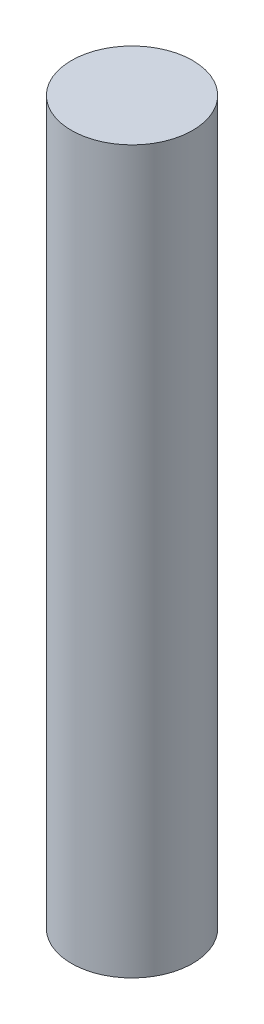
ISO-10303-21;
HEADER;
FILE_DESCRIPTION(('STEP AP214'),'2;1');
FILE_NAME('part.step','',(''),(''),'','','');
FILE_SCHEMA(('AUTOMOTIVE_DESIGN { 1 0 10303 214 1 1 1 1 }'));
ENDSEC;
DATA;
#1=APPLICATION_CONTEXT('core data for automotive mechanical design processes');
#2=APPLICATION_PROTOCOL_DEFINITION('international standard','automotive_design',2000,#1);
#3=PRODUCT_CONTEXT('',#1,'mechanical');
#4=PRODUCT('Part','Part','',(#3));
#5=PRODUCT_RELATED_PRODUCT_CATEGORY('part','',(#4));
#6=PRODUCT_DEFINITION_FORMATION('','',#4);
#7=PRODUCT_DEFINITION_CONTEXT('part definition',#1,'design');
#8=PRODUCT_DEFINITION('design','',#6,#7);
#9=PRODUCT_DEFINITION_SHAPE('','',#8);
#10=(LENGTH_UNIT() NAMED_UNIT(*) SI_UNIT(.MILLI.,.METRE.));
#11=(NAMED_UNIT(*) PLANE_ANGLE_UNIT() SI_UNIT($,.RADIAN.));
#12=(NAMED_UNIT(*) SI_UNIT($,.STERADIAN.) SOLID_ANGLE_UNIT());
#13=UNCERTAINTY_MEASURE_WITH_UNIT(LENGTH_MEASURE(1.E-05),#10,'distance_accuracy_value','');
#14=(GEOMETRIC_REPRESENTATION_CONTEXT(3) GLOBAL_UNCERTAINTY_ASSIGNED_CONTEXT((#13)) GLOBAL_UNIT_ASSIGNED_CONTEXT((#10,
#11,#12)) REPRESENTATION_CONTEXT('',''));
#15=CARTESIAN_POINT('',(0.,0.,0.));
#16=DIRECTION('',(0.,0.,1.));
#17=DIRECTION('',(1.,0.,0.));
#18=AXIS2_PLACEMENT_3D('',#15,#16,#17);
#19=CARTESIAN_POINT('',(0.,19.05,0.));
#20=DIRECTION('',(0.,-1.,0.));
#21=DIRECTION('',(0.,0.,-1.));
#22=AXIS2_PLACEMENT_3D('',#19,#20,#21);
#23=CYLINDRICAL_SURFACE('',#22,1.6002);
#24=CARTESIAN_POINT('',(0.,19.05,0.));
#25=DIRECTION('',(0.,1.,0.));
#26=DIRECTION('',(0.,0.,1.));
#27=AXIS2_PLACEMENT_3D('',#24,#25,#26);
#28=CIRCLE('',#27,1.6002);
#29=CARTESIAN_POINT('',(0.,19.05,-1.6002));
#30=VERTEX_POINT('',#29);
#31=EDGE_CURVE('E10',#30,#30,#28,.T.);
#32=CARTESIAN_POINT('',(0.,0.,0.));
#33=DIRECTION('',(0.,1.,0.));
#34=DIRECTION('',(0.,0.,1.));
#35=AXIS2_PLACEMENT_3D('',#32,#33,#34);
#36=CIRCLE('',#35,1.6002);
#37=CARTESIAN_POINT('',(0.,0.,-1.6002));
#38=VERTEX_POINT('',#37);
#39=EDGE_CURVE('E34',#38,#38,#36,.T.);
#40=CARTESIAN_POINT('',(0.,19.05,-1.6002));
#41=CARTESIAN_POINT('',(0.,18.8515625,-1.6002));
#42=CARTESIAN_POINT('',(0.,18.653125,-1.6002));
#43=CARTESIAN_POINT('',(0.,18.25625,-1.6002));
#44=CARTESIAN_POINT('',(0.,18.0578125,-1.6002));
#45=CARTESIAN_POINT('',(0.,17.6609375,-1.6002));
#46=CARTESIAN_POINT('',(0.,17.4625,-1.6002));
#47=CARTESIAN_POINT('',(0.,17.065625,-1.6002));
#48=CARTESIAN_POINT('',(0.,16.8671875,-1.6002));
#49=CARTESIAN_POINT('',(0.,16.4703125,-1.6002));
#50=CARTESIAN_POINT('',(0.,16.271875,-1.6002));
#51=CARTESIAN_POINT('',(0.,15.875,-1.6002));
#52=CARTESIAN_POINT('',(0.,15.6765625,-1.6002));
#53=CARTESIAN_POINT('',(0.,15.2796875,-1.6002));
#54=CARTESIAN_POINT('',(0.,15.08125,-1.6002));
#55=CARTESIAN_POINT('',(0.,14.684375,-1.6002));
#56=CARTESIAN_POINT('',(0.,14.4859375,-1.6002));
#57=CARTESIAN_POINT('',(0.,14.0890625,-1.6002));
#58=CARTESIAN_POINT('',(0.,13.890625,-1.6002));
#59=CARTESIAN_POINT('',(0.,13.49375,-1.6002));
#60=CARTESIAN_POINT('',(0.,13.2953125,-1.6002));
#61=CARTESIAN_POINT('',(0.,12.8984375,-1.6002));
#62=CARTESIAN_POINT('',(0.,12.7,-1.6002));
#63=CARTESIAN_POINT('',(0.,12.303125,-1.6002));
#64=CARTESIAN_POINT('',(0.,12.1046875,-1.6002));
#65=CARTESIAN_POINT('',(0.,11.7078125,-1.6002));
#66=CARTESIAN_POINT('',(0.,11.509375,-1.6002));
#67=CARTESIAN_POINT('',(0.,11.1125,-1.6002));
#68=CARTESIAN_POINT('',(0.,10.9140625,-1.6002));
#69=CARTESIAN_POINT('',(0.,10.5171875,-1.6002));
#70=CARTESIAN_POINT('',(0.,10.31875,-1.6002));
#71=CARTESIAN_POINT('',(0.,9.921875,-1.6002));
#72=CARTESIAN_POINT('',(0.,9.7234375,-1.6002));
#73=CARTESIAN_POINT('',(0.,9.3265625,-1.6002));
#74=CARTESIAN_POINT('',(0.,9.128125,-1.6002));
#75=CARTESIAN_POINT('',(0.,8.73125,-1.6002));
#76=CARTESIAN_POINT('',(0.,8.5328125,-1.6002));
#77=CARTESIAN_POINT('',(0.,8.1359375,-1.6002));
#78=CARTESIAN_POINT('',(0.,7.9375,-1.6002));
#79=CARTESIAN_POINT('',(0.,7.540625,-1.6002));
#80=CARTESIAN_POINT('',(0.,7.3421875,-1.6002));
#81=CARTESIAN_POINT('',(0.,6.9453125,-1.6002));
#82=CARTESIAN_POINT('',(0.,6.746875,-1.6002));
#83=CARTESIAN_POINT('',(0.,6.35,-1.6002));
#84=CARTESIAN_POINT('',(0.,6.1515625,-1.6002));
#85=CARTESIAN_POINT('',(0.,5.7546875,-1.6002));
#86=CARTESIAN_POINT('',(0.,5.55625,-1.6002));
#87=CARTESIAN_POINT('',(0.,5.159375,-1.6002));
#88=CARTESIAN_POINT('',(0.,4.9609375,-1.6002));
#89=CARTESIAN_POINT('',(0.,4.5640625,-1.6002));
#90=CARTESIAN_POINT('',(0.,4.365625,-1.6002));
#91=CARTESIAN_POINT('',(0.,3.96875,-1.6002));
#92=CARTESIAN_POINT('',(0.,3.7703125,-1.6002));
#93=CARTESIAN_POINT('',(0.,3.3734375,-1.6002));
#94=CARTESIAN_POINT('',(0.,3.175,-1.6002));
#95=CARTESIAN_POINT('',(0.,2.778125,-1.6002));
#96=CARTESIAN_POINT('',(0.,2.5796875,-1.6002));
#97=CARTESIAN_POINT('',(0.,2.1828125,-1.6002));
#98=CARTESIAN_POINT('',(0.,1.984375,-1.6002));
#99=CARTESIAN_POINT('',(0.,1.5875,-1.6002));
#100=CARTESIAN_POINT('',(0.,1.3890625,-1.6002));
#101=CARTESIAN_POINT('',(0.,0.992187500000001,-1.6002));
#102=CARTESIAN_POINT('',(0.,0.793750000000001,-1.6002));
#103=CARTESIAN_POINT('',(0.,0.396875,-1.6002));
#104=CARTESIAN_POINT('',(0.,0.1984375,-1.6002));
#105=CARTESIAN_POINT('',(0.,0.,-1.6002));
#106=B_SPLINE_CURVE_WITH_KNOTS('',3,(#40,#41,#42,#43,#44,#45,#46,#47,#48,#49,#50,#51,#52,#53,
#54,#55,#56,#57,#58,#59,#60,#61,#62,#63,#64,#65,#66,#67,#68,#69,#70,#71,#72,#73,#74,#75,#76,#77,
#78,#79,#80,#81,#82,#83,#84,#85,#86,#87,#88,#89,#90,#91,#92,#93,#94,#95,#96,#97,#98,#99,#100,
#101,#102,#103,#104,#105),.UNSPECIFIED.,.F.,.F.,(4,2,2,2,2,2,2,2,2,2,2,2,2,2,2,2,2,2,2,2,2,2,2,
2,2,2,2,2,2,2,2,2,4),(0.,0.595312499999997,1.190625,1.7859375,2.38125,2.9765625,3.571875,
4.1671875,4.7625,5.3578125,5.953125,6.5484375,7.14375,7.7390625,8.334375,8.9296875,9.525,
10.1203125,10.715625,11.3109375,11.90625,12.5015625,13.096875,13.6921875,14.2875,14.8828125,
15.478125,16.0734375,16.66875,17.2640625,17.859375,18.4546875,19.05),.UNSPECIFIED.);
#107=EDGE_CURVE('BSEAM31',#30,#38,#106,.T.);
#108=ORIENTED_EDGE('',*,*,#31,.F.);
#109=ORIENTED_EDGE('',*,*,#39,.T.);
#110=ORIENTED_EDGE('',*,*,#107,.T.);
#111=ORIENTED_EDGE('',*,*,#107,.F.);
#112=EDGE_LOOP('',(#108,#110,#109,#111));
#113=FACE_BOUND('',#112,.T.);
#114=ADVANCED_FACE('F31',(#113),#23,.T.);
#115=CARTESIAN_POINT('',(0.,19.05,0.));
#116=DIRECTION('',(0.,1.,0.));
#117=DIRECTION('',(0.,0.,1.));
#118=AXIS2_PLACEMENT_3D('',#115,#116,#117);
#119=PLANE('',#118);
#120=ORIENTED_EDGE('',*,*,#31,.T.);
#121=EDGE_LOOP('',(#120));
#122=FACE_BOUND('',#121,.T.);
#123=ADVANCED_FACE('F46',(#122),#119,.T.);
#124=CARTESIAN_POINT('',(0.,0.,0.));
#125=DIRECTION('',(0.,1.,0.));
#126=DIRECTION('',(0.,0.,1.));
#127=AXIS2_PLACEMENT_3D('',#124,#125,#126);
#128=PLANE('',#127);
#129=ORIENTED_EDGE('',*,*,#39,.F.);
#130=EDGE_LOOP('',(#129));
#131=FACE_BOUND('',#130,.T.);
#132=ADVANCED_FACE('F44',(#131),#128,.F.);
#133=CLOSED_SHELL('',(#114,#123,#132));
#134=MANIFOLD_SOLID_BREP('B2',#133);
#135=ADVANCED_BREP_SHAPE_REPRESENTATION('',(#18,#134),#14);
#136=SHAPE_DEFINITION_REPRESENTATION(#9,#135);
ENDSEC;
END-ISO-10303-21;
